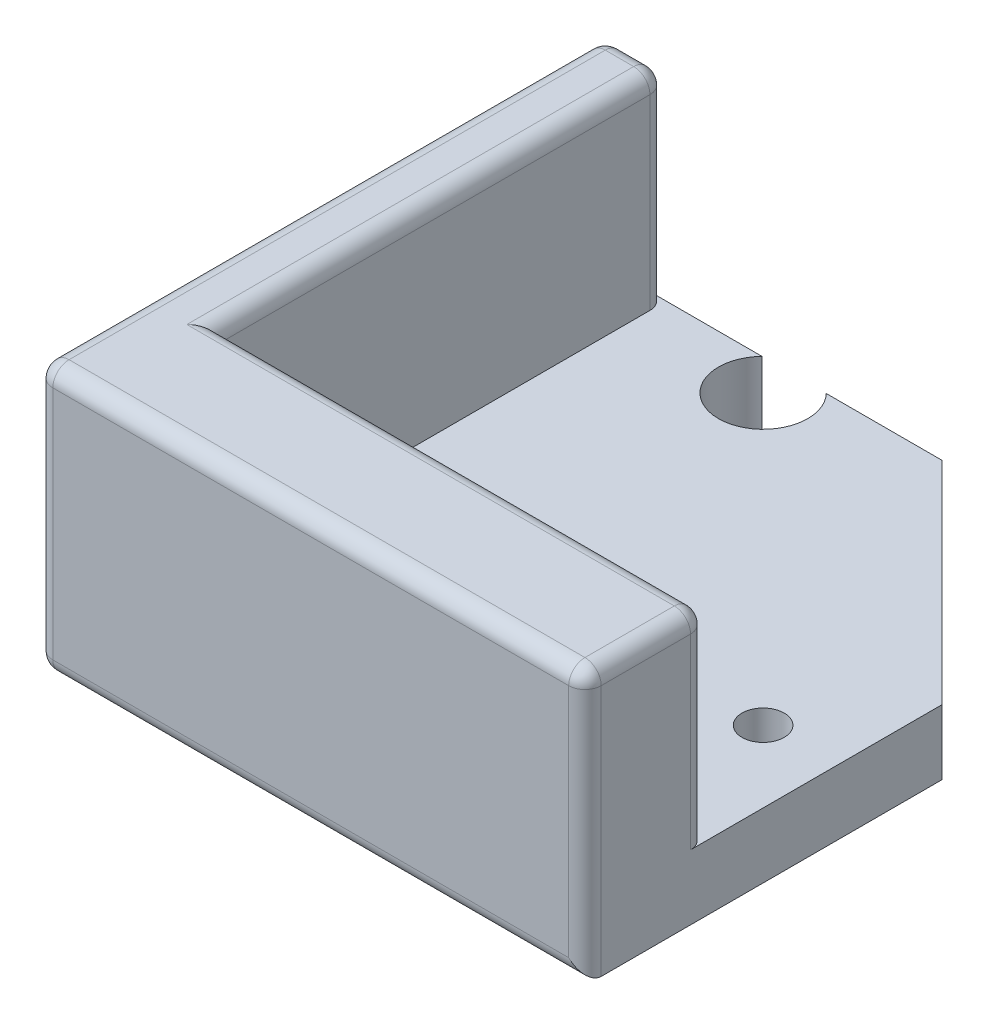
ISO-10303-21;
HEADER;
FILE_DESCRIPTION(('STEP AP214'),'2;1');
FILE_NAME('part.step','',(''),(''),'','','');
FILE_SCHEMA(('AUTOMOTIVE_DESIGN { 1 0 10303 214 1 1 1 1 }'));
ENDSEC;
DATA;
#1=APPLICATION_CONTEXT('core data for automotive mechanical design processes');
#2=APPLICATION_PROTOCOL_DEFINITION('international standard','automotive_design',2000,#1);
#3=PRODUCT_CONTEXT('',#1,'mechanical');
#4=PRODUCT('Part','Part','',(#3));
#5=PRODUCT_RELATED_PRODUCT_CATEGORY('part','',(#4));
#6=PRODUCT_DEFINITION_FORMATION('','',#4);
#7=PRODUCT_DEFINITION_CONTEXT('part definition',#1,'design');
#8=PRODUCT_DEFINITION('design','',#6,#7);
#9=PRODUCT_DEFINITION_SHAPE('','',#8);
#10=(LENGTH_UNIT() NAMED_UNIT(*) SI_UNIT(.MILLI.,.METRE.));
#11=(NAMED_UNIT(*) PLANE_ANGLE_UNIT() SI_UNIT($,.RADIAN.));
#12=(NAMED_UNIT(*) SI_UNIT($,.STERADIAN.) SOLID_ANGLE_UNIT());
#13=UNCERTAINTY_MEASURE_WITH_UNIT(LENGTH_MEASURE(1.E-05),#10,'distance_accuracy_value','');
#14=(GEOMETRIC_REPRESENTATION_CONTEXT(3) GLOBAL_UNCERTAINTY_ASSIGNED_CONTEXT((#13)) GLOBAL_UNIT_ASSIGNED_CONTEXT((#10,
#11,#12)) REPRESENTATION_CONTEXT('',''));
#15=CARTESIAN_POINT('',(0.,0.,0.));
#16=DIRECTION('',(0.,0.,1.));
#17=DIRECTION('',(1.,0.,0.));
#18=AXIS2_PLACEMENT_3D('',#15,#16,#17);
#19=CARTESIAN_POINT('',(0.,2.54,0.));
#20=DIRECTION('',(0.,1.,0.));
#21=DIRECTION('',(0.,0.,1.));
#22=AXIS2_PLACEMENT_3D('',#19,#20,#21);
#23=PLANE('',#22);
#24=DIRECTION('',(-1.,0.,0.));
#25=VECTOR('',#24,1.);
#26=CARTESIAN_POINT('',(0.,2.54,-33.655));
#27=LINE('',#26,#25);
#28=CARTESIAN_POINT('',(-1.27,2.54,-33.655));
#29=VERTEX_POINT('',#28);
#30=CARTESIAN_POINT('',(-3.4925,2.54,-33.655));
#31=VERTEX_POINT('',#30);
#32=EDGE_CURVE('E72',#29,#31,#27,.T.);
#33=ORIENTED_EDGE('',*,*,#32,.T.);
#34=DIRECTION('',(0.,0.,1.));
#35=VECTOR('',#34,1.);
#36=CARTESIAN_POINT('',(-3.4925,2.54,0.));
#37=LINE('',#36,#35);
#38=CARTESIAN_POINT('',(-3.4925,2.54,8.255));
#39=VERTEX_POINT('',#38);
#40=EDGE_CURVE('E255',#31,#39,#37,.T.);
#41=ORIENTED_EDGE('',*,*,#40,.T.);
#42=DIRECTION('',(-1.,0.,0.));
#43=VECTOR('',#42,1.);
#44=CARTESIAN_POINT('',(38.1,2.54,8.255));
#45=LINE('',#44,#43);
#46=CARTESIAN_POINT('',(36.83,2.54,8.255));
#47=VERTEX_POINT('',#46);
#48=EDGE_CURVE('E350',#39,#47,#45,.F.);
#49=ORIENTED_EDGE('',*,*,#48,.T.);
#50=DIRECTION('',(0.,0.,-1.));
#51=VECTOR('',#50,1.);
#52=CARTESIAN_POINT('',(36.83,2.54,0.));
#53=LINE('',#52,#51);
#54=CARTESIAN_POINT('',(36.83,2.54,1.27));
#55=VERTEX_POINT('',#54);
#56=EDGE_CURVE('E358',#47,#55,#53,.T.);
#57=ORIENTED_EDGE('',*,*,#56,.T.);
#58=DIRECTION('',(1.,0.,0.));
#59=VECTOR('',#58,1.);
#60=CARTESIAN_POINT('',(0.,2.54,1.27));
#61=LINE('',#60,#59);
#62=CARTESIAN_POINT('',(-1.27,2.54,1.27));
#63=VERTEX_POINT('',#62);
#64=EDGE_CURVE('E362',#55,#63,#61,.F.);
#65=ORIENTED_EDGE('',*,*,#64,.T.);
#66=DIRECTION('',(0.,0.,1.));
#67=VECTOR('',#66,1.);
#68=CARTESIAN_POINT('',(-1.27,2.54,-38.1));
#69=LINE('',#68,#67);
#70=EDGE_CURVE('E365',#63,#29,#69,.F.);
#71=ORIENTED_EDGE('',*,*,#70,.T.);
#72=EDGE_LOOP('',(#33,#41,#49,#57,#65,#71));
#73=FACE_BOUND('',#72,.T.);
#74=ADVANCED_FACE('F46',(#73),#23,.T.);
#75=CARTESIAN_POINT('',(0.,-13.335,0.));
#76=DIRECTION('',(-1.,0.,0.));
#77=DIRECTION('',(0.,0.,1.));
#78=AXIS2_PLACEMENT_3D('',#75,#76,#77);
#79=PLANE('',#78);
#80=DIRECTION('',(0.,0.,1.));
#81=VECTOR('',#80,1.);
#82=CARTESIAN_POINT('',(0.,-13.335,0.));
#83=LINE('',#82,#81);
#84=CARTESIAN_POINT('',(0.,-13.335,-33.655));
#85=VERTEX_POINT('',#84);
#86=CARTESIAN_POINT('',(0.,-13.335,0.));
#87=VERTEX_POINT('',#86);
#88=EDGE_CURVE('E337',#85,#87,#83,.T.);
#89=ORIENTED_EDGE('',*,*,#88,.F.);
#90=DIRECTION('',(0.,-1.,0.));
#91=VECTOR('',#90,1.);
#92=CARTESIAN_POINT('',(0.,1.27,-33.655));
#93=LINE('',#92,#91);
#94=CARTESIAN_POINT('',(0.,1.27,-33.655));
#95=VERTEX_POINT('',#94);
#96=EDGE_CURVE('E229',#85,#95,#93,.F.);
#97=ORIENTED_EDGE('',*,*,#96,.T.);
#98=DIRECTION('',(0.,0.,1.));
#99=VECTOR('',#98,1.);
#100=CARTESIAN_POINT('',(0.,1.27,0.));
#101=LINE('',#100,#99);
#102=CARTESIAN_POINT('',(0.,1.27,0.));
#103=VERTEX_POINT('',#102);
#104=EDGE_CURVE('E378',#95,#103,#101,.T.);
#105=ORIENTED_EDGE('',*,*,#104,.T.);
#106=DIRECTION('',(0.,1.,0.));
#107=VECTOR('',#106,1.);
#108=CARTESIAN_POINT('',(0.,-13.335,0.));
#109=LINE('',#108,#107);
#110=EDGE_CURVE('E344',#87,#103,#109,.T.);
#111=ORIENTED_EDGE('',*,*,#110,.F.);
#112=EDGE_LOOP('',(#89,#97,#105,#111));
#113=FACE_BOUND('',#112,.T.);
#114=ADVANCED_FACE('F341',(#113),#79,.F.);
#115=CARTESIAN_POINT('',(0.,-13.335,9.525));
#116=DIRECTION('',(0.,0.,-1.));
#117=DIRECTION('',(-1.,0.,0.));
#118=AXIS2_PLACEMENT_3D('',#115,#116,#117);
#119=PLANE('',#118);
#120=DIRECTION('',(-1.,0.,0.));
#121=VECTOR('',#120,1.);
#122=CARTESIAN_POINT('',(-9.52499999999999,1.27,9.525));
#123=LINE('',#122,#121);
#124=CARTESIAN_POINT('',(36.83,1.27,9.525));
#125=VERTEX_POINT('',#124);
#126=CARTESIAN_POINT('',(-3.49249999999999,1.27,9.525));
#127=VERTEX_POINT('',#126);
#128=EDGE_CURVE('E387',#125,#127,#123,.T.);
#129=ORIENTED_EDGE('',*,*,#128,.T.);
#130=DIRECTION('',(0.,1.,0.));
#131=VECTOR('',#130,1.);
#132=CARTESIAN_POINT('',(-3.49249999999999,-17.145,9.525));
#133=LINE('',#132,#131);
#134=CARTESIAN_POINT('',(-3.4925,-17.145,9.525));
#135=VERTEX_POINT('',#134);
#136=EDGE_CURVE('E56',#127,#135,#133,.F.);
#137=ORIENTED_EDGE('',*,*,#136,.T.);
#138=DIRECTION('',(-1.,0.,0.));
#139=VECTOR('',#138,1.);
#140=CARTESIAN_POINT('',(38.1,-17.145,9.525));
#141=LINE('',#140,#139);
#142=CARTESIAN_POINT('',(36.83,-17.145,9.525));
#143=VERTEX_POINT('',#142);
#144=EDGE_CURVE('E390',#135,#143,#141,.F.);
#145=ORIENTED_EDGE('',*,*,#144,.T.);
#146=DIRECTION('',(0.,1.,0.));
#147=VECTOR('',#146,1.);
#148=CARTESIAN_POINT('',(36.83,-13.335,9.525));
#149=LINE('',#148,#147);
#150=EDGE_CURVE('E393',#143,#125,#149,.T.);
#151=ORIENTED_EDGE('',*,*,#150,.T.);
#152=EDGE_LOOP('',(#129,#137,#145,#151));
#153=FACE_BOUND('',#152,.T.);
#154=ADVANCED_FACE('F508',(#153),#119,.F.);
#155=CARTESIAN_POINT('',(0.,-13.335,0.));
#156=DIRECTION('',(0.,-1.,0.));
#157=DIRECTION('',(0.,0.,-1.));
#158=AXIS2_PLACEMENT_3D('',#155,#156,#157);
#159=PLANE('',#158);
#160=CARTESIAN_POINT('',(32.5,-13.335,-10.));
#161=DIRECTION('',(0.,-1.,0.));
#162=DIRECTION('',(0.,0.,-1.));
#163=AXIS2_PLACEMENT_3D('',#160,#161,#162);
#164=CIRCLE('',#163,1.65);
#165=CARTESIAN_POINT('',(32.5,-13.335,-11.65));
#166=VERTEX_POINT('',#165);
#167=EDGE_CURVE('E435',#166,#166,#164,.T.);
#168=ORIENTED_EDGE('',*,*,#167,.T.);
#169=EDGE_LOOP('',(#168));
#170=FACE_BOUND('',#169,.T.);
#171=DIRECTION('',(1.,0.,0.));
#172=VECTOR('',#171,1.);
#173=CARTESIAN_POINT('',(0.,-13.335,-34.925));
#174=LINE('',#173,#172);
#175=CARTESIAN_POINT('',(-1.27,-13.335,-34.925));
#176=VERTEX_POINT('',#175);
#177=CARTESIAN_POINT('',(7.48664939771626,-13.335,-34.925));
#178=VERTEX_POINT('',#177);
#179=EDGE_CURVE('E185',#176,#178,#174,.T.);
#180=ORIENTED_EDGE('',*,*,#179,.F.);
#181=CARTESIAN_POINT('',(-1.27,-13.335,-33.655));
#182=DIRECTION('',(0.,-1.,0.));
#183=DIRECTION('',(0.,0.,-1.));
#184=AXIS2_PLACEMENT_3D('',#181,#182,#183);
#185=CIRCLE('',#184,1.27);
#186=EDGE_CURVE('E11',#176,#85,#185,.T.);
#187=ORIENTED_EDGE('',*,*,#186,.T.);
#188=ORIENTED_EDGE('',*,*,#88,.T.);
#189=DIRECTION('',(-1.,0.,0.));
#190=VECTOR('',#189,1.);
#191=CARTESIAN_POINT('',(0.,-13.335,0.));
#192=LINE('',#191,#190);
#193=CARTESIAN_POINT('',(36.83,-13.335,0.));
#194=VERTEX_POINT('',#193);
#195=EDGE_CURVE('E346',#194,#87,#192,.T.);
#196=ORIENTED_EDGE('',*,*,#195,.F.);
#197=CARTESIAN_POINT('',(36.83,-13.335,1.27));
#198=DIRECTION('',(0.,-1.,0.));
#199=DIRECTION('',(0.,0.,-1.));
#200=AXIS2_PLACEMENT_3D('',#197,#198,#199);
#201=CIRCLE('',#200,1.27);
#202=CARTESIAN_POINT('',(38.1,-13.335,1.27));
#203=VERTEX_POINT('',#202);
#204=EDGE_CURVE('E223',#194,#203,#201,.T.);
#205=ORIENTED_EDGE('',*,*,#204,.T.);
#206=DIRECTION('',(0.,0.,1.));
#207=VECTOR('',#206,1.);
#208=CARTESIAN_POINT('',(38.1,-13.335,9.52500000000001));
#209=LINE('',#208,#207);
#210=CARTESIAN_POINT('',(38.1,-13.335,-18.3730790919814));
#211=VERTEX_POINT('',#210);
#212=EDGE_CURVE('E449',#211,#203,#209,.T.);
#213=ORIENTED_EDGE('',*,*,#212,.F.);
#214=DIRECTION('',(0.707106781186549,0.,0.707106781186546));
#215=VECTOR('',#214,1.);
#216=CARTESIAN_POINT('',(38.1,-13.335,-18.3730790919814));
#217=LINE('',#216,#215);
#218=CARTESIAN_POINT('',(21.5480790919814,-13.335,-34.925));
#219=VERTEX_POINT('',#218);
#220=EDGE_CURVE('E441',#219,#211,#217,.T.);
#221=ORIENTED_EDGE('',*,*,#220,.F.);
#222=DIRECTION('',(1.,0.,0.));
#223=VECTOR('',#222,1.);
#224=CARTESIAN_POINT('',(0.,-13.335,-34.925));
#225=LINE('',#224,#223);
#226=CARTESIAN_POINT('',(12.5133506022837,-13.335,-34.925));
#227=VERTEX_POINT('',#226);
#228=EDGE_CURVE('E860',#227,#219,#225,.T.);
#229=ORIENTED_EDGE('',*,*,#228,.F.);
#230=CARTESIAN_POINT('',(10.,-13.335,-32.5));
#231=DIRECTION('',(0.,1.,0.));
#232=DIRECTION('',(0.,0.,1.));
#233=AXIS2_PLACEMENT_3D('',#230,#231,#232);
#234=CIRCLE('',#233,3.4925);
#235=EDGE_CURVE('E208',#178,#227,#234,.T.);
#236=ORIENTED_EDGE('',*,*,#235,.F.);
#237=EDGE_LOOP('',(#180,#187,#188,#196,#205,#213,#221,#229,#236));
#238=FACE_BOUND('',#237,.T.);
#239=ADVANCED_FACE('F335',(#170,#238),#159,.F.);
#240=CARTESIAN_POINT('',(38.1,-18.415,-18.3730790919814));
#241=DIRECTION('',(-0.707106781186546,0.,0.707106781186549));
#242=DIRECTION('',(0.707106781186549,0.,0.707106781186546));
#243=AXIS2_PLACEMENT_3D('',#240,#241,#242);
#244=PLANE('',#243);
#245=DIRECTION('',(0.,-1.,0.));
#246=VECTOR('',#245,1.);
#247=CARTESIAN_POINT('',(21.5480790919814,-18.415,-34.925));
#248=LINE('',#247,#246);
#249=CARTESIAN_POINT('',(21.5480790919814,-18.415,-34.925));
#250=VERTEX_POINT('',#249);
#251=EDGE_CURVE('E858',#219,#250,#248,.T.);
#252=ORIENTED_EDGE('',*,*,#251,.F.);
#253=ORIENTED_EDGE('',*,*,#220,.T.);
#254=DIRECTION('',(0.,1.,0.));
#255=VECTOR('',#254,1.);
#256=CARTESIAN_POINT('',(38.1,-18.415,-18.3730790919814));
#257=LINE('',#256,#255);
#258=CARTESIAN_POINT('',(38.1,-18.415,-18.3730790919814));
#259=VERTEX_POINT('',#258);
#260=EDGE_CURVE('E352',#259,#211,#257,.T.);
#261=ORIENTED_EDGE('',*,*,#260,.F.);
#262=DIRECTION('',(0.707106781186549,0.,0.707106781186546));
#263=VECTOR('',#262,1.);
#264=CARTESIAN_POINT('',(38.1,-18.415,-18.3730790919814));
#265=LINE('',#264,#263);
#266=EDGE_CURVE('E445',#250,#259,#265,.T.);
#267=ORIENTED_EDGE('',*,*,#266,.F.);
#268=EDGE_LOOP('',(#252,#253,#261,#267));
#269=FACE_BOUND('',#268,.T.);
#270=ADVANCED_FACE('F577',(#269),#244,.F.);
#271=CARTESIAN_POINT('',(0.,-18.415,0.));
#272=DIRECTION('',(0.,-1.,0.));
#273=DIRECTION('',(0.,0.,-1.));
#274=AXIS2_PLACEMENT_3D('',#271,#272,#273);
#275=PLANE('',#274);
#276=CARTESIAN_POINT('',(32.5,-18.415,-10.));
#277=DIRECTION('',(0.,-1.,0.));
#278=DIRECTION('',(0.,0.,-1.));
#279=AXIS2_PLACEMENT_3D('',#276,#277,#278);
#280=CIRCLE('',#279,1.65);
#281=CARTESIAN_POINT('',(32.5,-18.415,-11.65));
#282=VERTEX_POINT('',#281);
#283=EDGE_CURVE('E428',#282,#282,#280,.T.);
#284=ORIENTED_EDGE('',*,*,#283,.F.);
#285=EDGE_LOOP('',(#284));
#286=FACE_BOUND('',#285,.T.);
#287=DIRECTION('',(-1.,0.,0.));
#288=VECTOR('',#287,1.);
#289=CARTESIAN_POINT('',(-9.52499999999999,-18.415,8.255));
#290=LINE('',#289,#288);
#291=CARTESIAN_POINT('',(38.1,-18.415,8.255));
#292=VERTEX_POINT('',#291);
#293=CARTESIAN_POINT('',(-3.49249999999999,-18.415,8.255));
#294=VERTEX_POINT('',#293);
#295=EDGE_CURVE('E397',#292,#294,#290,.T.);
#296=ORIENTED_EDGE('',*,*,#295,.T.);
#297=DIRECTION('',(0.,0.,1.));
#298=VECTOR('',#297,1.);
#299=CARTESIAN_POINT('',(-3.4925,-18.415,0.));
#300=LINE('',#299,#298);
#301=CARTESIAN_POINT('',(-3.4925,-18.415,-34.925));
#302=VERTEX_POINT('',#301);
#303=EDGE_CURVE('E201',#294,#302,#300,.F.);
#304=ORIENTED_EDGE('',*,*,#303,.T.);
#305=DIRECTION('',(-1.,0.,0.));
#306=VECTOR('',#305,1.);
#307=CARTESIAN_POINT('',(0.,-18.415,-34.925));
#308=LINE('',#307,#306);
#309=CARTESIAN_POINT('',(7.48664939771626,-18.415,-34.925));
#310=VERTEX_POINT('',#309);
#311=EDGE_CURVE('E183',#310,#302,#308,.T.);
#312=ORIENTED_EDGE('',*,*,#311,.F.);
#313=CARTESIAN_POINT('',(10.,-18.415,-32.5));
#314=DIRECTION('',(0.,-1.,0.));
#315=DIRECTION('',(0.,0.,-1.));
#316=AXIS2_PLACEMENT_3D('',#313,#314,#315);
#317=CIRCLE('',#316,3.4925);
#318=CARTESIAN_POINT('',(12.5133506022837,-18.415,-34.925));
#319=VERTEX_POINT('',#318);
#320=EDGE_CURVE('E199',#319,#310,#317,.T.);
#321=ORIENTED_EDGE('',*,*,#320,.F.);
#322=DIRECTION('',(-1.,0.,0.));
#323=VECTOR('',#322,1.);
#324=CARTESIAN_POINT('',(0.,-18.415,-34.925));
#325=LINE('',#324,#323);
#326=EDGE_CURVE('E192',#250,#319,#325,.T.);
#327=ORIENTED_EDGE('',*,*,#326,.F.);
#328=ORIENTED_EDGE('',*,*,#266,.T.);
#329=DIRECTION('',(0.,0.,1.));
#330=VECTOR('',#329,1.);
#331=CARTESIAN_POINT('',(38.1,-18.415,9.52500000000001));
#332=LINE('',#331,#330);
#333=EDGE_CURVE('E448',#259,#292,#332,.T.);
#334=ORIENTED_EDGE('',*,*,#333,.T.);
#335=EDGE_LOOP('',(#296,#304,#312,#321,#327,#328,#334));
#336=FACE_BOUND('',#335,.T.);
#337=ADVANCED_FACE('F197',(#286,#336),#275,.T.);
#338=CARTESIAN_POINT('',(0.,-17.145,8.255));
#339=DIRECTION('',(1.,0.,0.));
#340=DIRECTION('',(0.,0.,-1.));
#341=AXIS2_PLACEMENT_3D('',#338,#339,#340);
#342=CYLINDRICAL_SURFACE('',#341,1.27);
#343=ORIENTED_EDGE('',*,*,#144,.F.);
#344=CARTESIAN_POINT('',(-3.49249999999999,-17.145,8.255));
#345=DIRECTION('',(1.,0.,0.));
#346=DIRECTION('',(0.,0.,-1.));
#347=AXIS2_PLACEMENT_3D('',#344,#345,#346);
#348=CIRCLE('',#347,1.27);
#349=EDGE_CURVE('E235',#135,#294,#348,.T.);
#350=ORIENTED_EDGE('',*,*,#349,.T.);
#351=ORIENTED_EDGE('',*,*,#295,.F.);
#352=CARTESIAN_POINT('',(36.83,-17.145,8.255));
#353=DIRECTION('',(0.707106781186547,0.707106781186547,0.));
#354=DIRECTION('',(0.707106781186547,-0.707106781186547,0.));
#355=AXIS2_PLACEMENT_3D('',#352,#353,#354);
#356=ELLIPSE('',#355,1.79605122421383,1.27);
#357=EDGE_CURVE('E217',#143,#292,#356,.T.);
#358=ORIENTED_EDGE('',*,*,#357,.F.);
#359=EDGE_LOOP('',(#343,#350,#351,#358));
#360=FACE_BOUND('',#359,.T.);
#361=ADVANCED_FACE('F531',(#360),#342,.T.);
#362=CARTESIAN_POINT('',(-1.27,1.27,0.));
#363=DIRECTION('',(0.,0.,-1.));
#364=DIRECTION('',(-1.,0.,0.));
#365=AXIS2_PLACEMENT_3D('',#362,#363,#364);
#366=CYLINDRICAL_SURFACE('',#365,1.27);
#367=ORIENTED_EDGE('',*,*,#104,.F.);
#368=CARTESIAN_POINT('',(-1.27,1.27,-33.655));
#369=DIRECTION('',(0.,0.,-1.));
#370=DIRECTION('',(-1.,0.,0.));
#371=AXIS2_PLACEMENT_3D('',#368,#369,#370);
#372=CIRCLE('',#371,1.27);
#373=EDGE_CURVE('E232',#95,#29,#372,.F.);
#374=ORIENTED_EDGE('',*,*,#373,.T.);
#375=ORIENTED_EDGE('',*,*,#70,.F.);
#376=CARTESIAN_POINT('',(-1.27,1.27,1.27));
#377=DIRECTION('',(-0.707106781186547,0.,-0.707106781186547));
#378=DIRECTION('',(0.707106781186547,0.,-0.707106781186547));
#379=AXIS2_PLACEMENT_3D('',#376,#377,#378);
#380=ELLIPSE('',#379,1.79605122421383,1.27);
#381=EDGE_CURVE('E419',#103,#63,#380,.F.);
#382=ORIENTED_EDGE('',*,*,#381,.F.);
#383=EDGE_LOOP('',(#367,#374,#375,#382));
#384=FACE_BOUND('',#383,.T.);
#385=ADVANCED_FACE('F524',(#384),#366,.T.);
#386=CARTESIAN_POINT('',(0.,1.27,8.255));
#387=DIRECTION('',(1.,0.,0.));
#388=DIRECTION('',(0.,0.,-1.));
#389=AXIS2_PLACEMENT_3D('',#386,#387,#388);
#390=CYLINDRICAL_SURFACE('',#389,1.27);
#391=ORIENTED_EDGE('',*,*,#48,.F.);
#392=CARTESIAN_POINT('',(-3.49249999999999,1.27,8.255));
#393=DIRECTION('',(1.,0.,0.));
#394=DIRECTION('',(0.,0.,-1.));
#395=AXIS2_PLACEMENT_3D('',#392,#393,#394);
#396=CIRCLE('',#395,1.27);
#397=EDGE_CURVE('E64',#39,#127,#396,.T.);
#398=ORIENTED_EDGE('',*,*,#397,.T.);
#399=ORIENTED_EDGE('',*,*,#128,.F.);
#400=CARTESIAN_POINT('',(36.83,1.27,8.255));
#401=DIRECTION('',(1.,0.,0.));
#402=DIRECTION('',(0.,0.,-1.));
#403=AXIS2_PLACEMENT_3D('',#400,#401,#402);
#404=CIRCLE('',#403,1.27);
#405=EDGE_CURVE('E413',#47,#125,#404,.T.);
#406=ORIENTED_EDGE('',*,*,#405,.F.);
#407=EDGE_LOOP('',(#391,#398,#399,#406));
#408=FACE_BOUND('',#407,.T.);
#409=ADVANCED_FACE('F485',(#408),#390,.T.);
#410=CARTESIAN_POINT('',(10.,-23.495,-32.5));
#411=DIRECTION('',(0.,1.,0.));
#412=DIRECTION('',(0.,0.,1.));
#413=AXIS2_PLACEMENT_3D('',#410,#411,#412);
#414=CYLINDRICAL_SURFACE('',#413,3.4925);
#415=DIRECTION('',(0.,1.,0.));
#416=VECTOR('',#415,1.);
#417=CARTESIAN_POINT('',(7.48664939771626,-18.415,-34.925));
#418=LINE('',#417,#416);
#419=EDGE_CURVE('E179',#310,#178,#418,.T.);
#420=ORIENTED_EDGE('',*,*,#419,.T.);
#421=ORIENTED_EDGE('',*,*,#235,.T.);
#422=DIRECTION('',(0.,1.,0.));
#423=VECTOR('',#422,1.);
#424=CARTESIAN_POINT('',(12.5133506022837,-18.415,-34.925));
#425=LINE('',#424,#423);
#426=EDGE_CURVE('E191',#319,#227,#425,.T.);
#427=ORIENTED_EDGE('',*,*,#426,.F.);
#428=ORIENTED_EDGE('',*,*,#320,.T.);
#429=EDGE_LOOP('',(#420,#421,#427,#428));
#430=FACE_BOUND('',#429,.T.);
#431=ADVANCED_FACE('F205',(#430),#414,.F.);
#432=CARTESIAN_POINT('',(38.1,2.54,0.));
#433=DIRECTION('',(-1.,0.,0.));
#434=DIRECTION('',(0.,0.,1.));
#435=AXIS2_PLACEMENT_3D('',#432,#433,#434);
#436=PLANE('',#435);
#437=DIRECTION('',(0.,0.,-1.));
#438=VECTOR('',#437,1.);
#439=CARTESIAN_POINT('',(38.1,1.27,9.525));
#440=LINE('',#439,#438);
#441=CARTESIAN_POINT('',(38.1,1.27,1.27));
#442=VERTEX_POINT('',#441);
#443=CARTESIAN_POINT('',(38.1,1.27,8.255));
#444=VERTEX_POINT('',#443);
#445=EDGE_CURVE('E371',#442,#444,#440,.F.);
#446=ORIENTED_EDGE('',*,*,#445,.T.);
#447=DIRECTION('',(0.,1.,0.));
#448=VECTOR('',#447,1.);
#449=CARTESIAN_POINT('',(38.1,2.54,8.255));
#450=LINE('',#449,#448);
#451=EDGE_CURVE('E375',#444,#292,#450,.F.);
#452=ORIENTED_EDGE('',*,*,#451,.T.);
#453=ORIENTED_EDGE('',*,*,#333,.F.);
#454=ORIENTED_EDGE('',*,*,#260,.T.);
#455=ORIENTED_EDGE('',*,*,#212,.T.);
#456=DIRECTION('',(0.,1.,0.));
#457=VECTOR('',#456,1.);
#458=CARTESIAN_POINT('',(38.1,2.54,1.27));
#459=LINE('',#458,#457);
#460=EDGE_CURVE('E368',#203,#442,#459,.T.);
#461=ORIENTED_EDGE('',*,*,#460,.T.);
#462=EDGE_LOOP('',(#446,#452,#453,#454,#455,#461));
#463=FACE_BOUND('',#462,.T.);
#464=ADVANCED_FACE('F462',(#463),#436,.F.);
#465=CARTESIAN_POINT('',(0.,-13.335,0.));
#466=DIRECTION('',(0.,0.,-1.));
#467=DIRECTION('',(-1.,0.,0.));
#468=AXIS2_PLACEMENT_3D('',#465,#466,#467);
#469=PLANE('',#468);
#470=ORIENTED_EDGE('',*,*,#110,.T.);
#471=DIRECTION('',(1.,0.,0.));
#472=VECTOR('',#471,1.);
#473=CARTESIAN_POINT('',(0.,1.27,0.));
#474=LINE('',#473,#472);
#475=CARTESIAN_POINT('',(36.83,1.27,0.));
#476=VERTEX_POINT('',#475);
#477=EDGE_CURVE('E384',#103,#476,#474,.T.);
#478=ORIENTED_EDGE('',*,*,#477,.T.);
#479=DIRECTION('',(0.,1.,0.));
#480=VECTOR('',#479,1.);
#481=CARTESIAN_POINT('',(36.83,-13.335,0.));
#482=LINE('',#481,#480);
#483=EDGE_CURVE('E381',#476,#194,#482,.F.);
#484=ORIENTED_EDGE('',*,*,#483,.T.);
#485=ORIENTED_EDGE('',*,*,#195,.T.);
#486=EDGE_LOOP('',(#470,#478,#484,#485));
#487=FACE_BOUND('',#486,.T.);
#488=ADVANCED_FACE('F498',(#487),#469,.T.);
#489=CARTESIAN_POINT('',(32.5,-18.415,-10.));
#490=DIRECTION('',(0.,-1.,0.));
#491=DIRECTION('',(0.,0.,-1.));
#492=AXIS2_PLACEMENT_3D('',#489,#490,#491);
#493=CYLINDRICAL_SURFACE('',#492,1.65);
#494=ORIENTED_EDGE('',*,*,#283,.T.);
#495=EDGE_LOOP('',(#494));
#496=FACE_BOUND('',#495,.T.);
#497=ORIENTED_EDGE('',*,*,#167,.F.);
#498=EDGE_LOOP('',(#497));
#499=FACE_BOUND('',#498,.T.);
#500=ADVANCED_FACE('F491',(#496,#499),#493,.F.);
#501=CARTESIAN_POINT('',(36.83,-13.335,8.255));
#502=DIRECTION('',(0.,1.,0.));
#503=DIRECTION('',(0.,0.,1.));
#504=AXIS2_PLACEMENT_3D('',#501,#502,#503);
#505=CYLINDRICAL_SURFACE('',#504,1.27);
#506=ORIENTED_EDGE('',*,*,#357,.T.);
#507=ORIENTED_EDGE('',*,*,#451,.F.);
#508=CARTESIAN_POINT('',(36.83,1.27,8.255));
#509=DIRECTION('',(0.,1.,0.));
#510=DIRECTION('',(-1.,0.,0.));
#511=AXIS2_PLACEMENT_3D('',#508,#509,#510);
#512=CIRCLE('',#511,1.27);
#513=EDGE_CURVE('E416',#125,#444,#512,.T.);
#514=ORIENTED_EDGE('',*,*,#513,.F.);
#515=ORIENTED_EDGE('',*,*,#150,.F.);
#516=EDGE_LOOP('',(#506,#507,#514,#515));
#517=FACE_BOUND('',#516,.T.);
#518=ADVANCED_FACE('F489',(#517),#505,.T.);
#519=CARTESIAN_POINT('',(0.,1.27,1.27));
#520=DIRECTION('',(1.,0.,0.));
#521=DIRECTION('',(0.,0.,-1.));
#522=AXIS2_PLACEMENT_3D('',#519,#520,#521);
#523=CYLINDRICAL_SURFACE('',#522,1.27);
#524=ORIENTED_EDGE('',*,*,#381,.T.);
#525=ORIENTED_EDGE('',*,*,#64,.F.);
#526=CARTESIAN_POINT('',(36.83,1.27,1.27));
#527=DIRECTION('',(1.,0.,0.));
#528=DIRECTION('',(0.,0.,-1.));
#529=AXIS2_PLACEMENT_3D('',#526,#527,#528);
#530=CIRCLE('',#529,1.27);
#531=EDGE_CURVE('E409',#476,#55,#530,.T.);
#532=ORIENTED_EDGE('',*,*,#531,.F.);
#533=ORIENTED_EDGE('',*,*,#477,.F.);
#534=EDGE_LOOP('',(#524,#525,#532,#533));
#535=FACE_BOUND('',#534,.T.);
#536=ADVANCED_FACE('F482',(#535),#523,.T.);
#537=CARTESIAN_POINT('',(36.83,2.54,1.27));
#538=DIRECTION('',(0.,-1.,0.));
#539=DIRECTION('',(0.,0.,-1.));
#540=AXIS2_PLACEMENT_3D('',#537,#538,#539);
#541=CYLINDRICAL_SURFACE('',#540,1.27);
#542=ORIENTED_EDGE('',*,*,#204,.F.);
#543=ORIENTED_EDGE('',*,*,#483,.F.);
#544=CARTESIAN_POINT('',(36.83,1.27,1.27));
#545=DIRECTION('',(0.,1.,0.));
#546=DIRECTION('',(0.,0.,1.));
#547=AXIS2_PLACEMENT_3D('',#544,#545,#546);
#548=CIRCLE('',#547,1.27);
#549=EDGE_CURVE('E405',#442,#476,#548,.T.);
#550=ORIENTED_EDGE('',*,*,#549,.F.);
#551=ORIENTED_EDGE('',*,*,#460,.F.);
#552=EDGE_LOOP('',(#542,#543,#550,#551));
#553=FACE_BOUND('',#552,.T.);
#554=ADVANCED_FACE('F472',(#553),#541,.T.);
#555=CARTESIAN_POINT('',(36.83,1.27,8.255));
#556=DIRECTION('',(0.,0.,1.));
#557=DIRECTION('',(0.,-1.,0.));
#558=AXIS2_PLACEMENT_3D('',#555,#556,#557);
#559=SPHERICAL_SURFACE('',#558,1.27);
#560=ORIENTED_EDGE('',*,*,#405,.T.);
#561=ORIENTED_EDGE('',*,*,#513,.T.);
#562=CARTESIAN_POINT('',(36.83,1.27,8.255));
#563=DIRECTION('',(0.,0.,1.));
#564=DIRECTION('',(1.,0.,0.));
#565=AXIS2_PLACEMENT_3D('',#562,#563,#564);
#566=CIRCLE('',#565,1.27);
#567=EDGE_CURVE('E212',#47,#444,#566,.F.);
#568=ORIENTED_EDGE('',*,*,#567,.F.);
#569=EDGE_LOOP('',(#560,#561,#568));
#570=FACE_BOUND('',#569,.T.);
#571=ADVANCED_FACE('F488',(#570),#559,.T.);
#572=CARTESIAN_POINT('',(36.83,1.27,1.27));
#573=DIRECTION('',(0.,0.,-1.));
#574=DIRECTION('',(0.,1.,0.));
#575=AXIS2_PLACEMENT_3D('',#572,#573,#574);
#576=SPHERICAL_SURFACE('',#575,1.27);
#577=ORIENTED_EDGE('',*,*,#549,.T.);
#578=ORIENTED_EDGE('',*,*,#531,.T.);
#579=CARTESIAN_POINT('',(36.83,1.27,1.27));
#580=DIRECTION('',(0.,0.,-1.));
#581=DIRECTION('',(-1.,0.,0.));
#582=AXIS2_PLACEMENT_3D('',#579,#580,#581);
#583=CIRCLE('',#582,1.27);
#584=EDGE_CURVE('E207',#442,#55,#583,.F.);
#585=ORIENTED_EDGE('',*,*,#584,.F.);
#586=EDGE_LOOP('',(#577,#578,#585));
#587=FACE_BOUND('',#586,.T.);
#588=ADVANCED_FACE('F480',(#587),#576,.T.);
#589=CARTESIAN_POINT('',(36.83,1.27,0.));
#590=DIRECTION('',(0.,0.,1.));
#591=DIRECTION('',(1.,0.,0.));
#592=AXIS2_PLACEMENT_3D('',#589,#590,#591);
#593=CYLINDRICAL_SURFACE('',#592,1.27);
#594=ORIENTED_EDGE('',*,*,#567,.T.);
#595=ORIENTED_EDGE('',*,*,#445,.F.);
#596=ORIENTED_EDGE('',*,*,#584,.T.);
#597=ORIENTED_EDGE('',*,*,#56,.F.);
#598=EDGE_LOOP('',(#594,#595,#596,#597));
#599=FACE_BOUND('',#598,.T.);
#600=ADVANCED_FACE('F476',(#599),#593,.T.);
#601=CARTESIAN_POINT('',(0.,-18.415,-34.925));
#602=DIRECTION('',(0.,0.,-1.));
#603=DIRECTION('',(-1.,0.,0.));
#604=AXIS2_PLACEMENT_3D('',#601,#602,#603);
#605=PLANE('',#604);
#606=ORIENTED_EDGE('',*,*,#228,.T.);
#607=ORIENTED_EDGE('',*,*,#251,.T.);
#608=ORIENTED_EDGE('',*,*,#326,.T.);
#609=ORIENTED_EDGE('',*,*,#426,.T.);
#610=EDGE_LOOP('',(#606,#607,#608,#609));
#611=FACE_BOUND('',#610,.T.);
#612=ADVANCED_FACE('F517',(#611),#605,.T.);
#613=CARTESIAN_POINT('',(0.,-18.415,-34.925));
#614=DIRECTION('',(0.,0.,-1.));
#615=DIRECTION('',(-1.,0.,0.));
#616=AXIS2_PLACEMENT_3D('',#613,#614,#615);
#617=PLANE('',#616);
#618=DIRECTION('',(0.,-1.,0.));
#619=VECTOR('',#618,1.);
#620=CARTESIAN_POINT('',(-1.27,-13.335,-34.925));
#621=LINE('',#620,#619);
#622=CARTESIAN_POINT('',(-1.27,1.27,-34.925));
#623=VERTEX_POINT('',#622);
#624=EDGE_CURVE('E226',#623,#176,#621,.T.);
#625=ORIENTED_EDGE('',*,*,#624,.T.);
#626=ORIENTED_EDGE('',*,*,#179,.T.);
#627=ORIENTED_EDGE('',*,*,#419,.F.);
#628=ORIENTED_EDGE('',*,*,#311,.T.);
#629=DIRECTION('',(0.,1.,0.));
#630=VECTOR('',#629,1.);
#631=CARTESIAN_POINT('',(-3.4925,-18.415,-34.925));
#632=LINE('',#631,#630);
#633=CARTESIAN_POINT('',(-3.4925,1.27,-34.925));
#634=VERTEX_POINT('',#633);
#635=EDGE_CURVE('E222',#302,#634,#632,.T.);
#636=ORIENTED_EDGE('',*,*,#635,.T.);
#637=DIRECTION('',(-1.,0.,0.));
#638=VECTOR('',#637,1.);
#639=CARTESIAN_POINT('',(0.,1.27,-34.925));
#640=LINE('',#639,#638);
#641=EDGE_CURVE('E219',#634,#623,#640,.F.);
#642=ORIENTED_EDGE('',*,*,#641,.T.);
#643=EDGE_LOOP('',(#625,#626,#627,#628,#636,#642));
#644=FACE_BOUND('',#643,.T.);
#645=ADVANCED_FACE('F182',(#644),#617,.T.);
#646=CARTESIAN_POINT('',(-4.7625,-18.415,0.));
#647=DIRECTION('',(-1.,0.,0.));
#648=DIRECTION('',(0.,0.,1.));
#649=AXIS2_PLACEMENT_3D('',#646,#647,#648);
#650=PLANE('',#649);
#651=DIRECTION('',(0.,1.,0.));
#652=VECTOR('',#651,1.);
#653=CARTESIAN_POINT('',(-4.7625,-18.415,-33.655));
#654=LINE('',#653,#652);
#655=CARTESIAN_POINT('',(-4.7625,1.27,-33.655));
#656=VERTEX_POINT('',#655);
#657=CARTESIAN_POINT('',(-4.7625,-17.145,-33.655));
#658=VERTEX_POINT('',#657);
#659=EDGE_CURVE('E244',#656,#658,#654,.F.);
#660=ORIENTED_EDGE('',*,*,#659,.T.);
#661=DIRECTION('',(0.,0.,1.));
#662=VECTOR('',#661,1.);
#663=CARTESIAN_POINT('',(-4.7625,-17.145,0.));
#664=LINE('',#663,#662);
#665=CARTESIAN_POINT('',(-4.76249999999999,-17.145,8.255));
#666=VERTEX_POINT('',#665);
#667=EDGE_CURVE('E247',#658,#666,#664,.T.);
#668=ORIENTED_EDGE('',*,*,#667,.T.);
#669=DIRECTION('',(0.,1.,0.));
#670=VECTOR('',#669,1.);
#671=CARTESIAN_POINT('',(-4.76249999999999,1.27,8.255));
#672=LINE('',#671,#670);
#673=CARTESIAN_POINT('',(-4.76249999999999,1.27,8.255));
#674=VERTEX_POINT('',#673);
#675=EDGE_CURVE('E238',#666,#674,#672,.T.);
#676=ORIENTED_EDGE('',*,*,#675,.T.);
#677=DIRECTION('',(0.,0.,1.));
#678=VECTOR('',#677,1.);
#679=CARTESIAN_POINT('',(-4.7625,1.27,0.));
#680=LINE('',#679,#678);
#681=EDGE_CURVE('E241',#674,#656,#680,.F.);
#682=ORIENTED_EDGE('',*,*,#681,.T.);
#683=EDGE_LOOP('',(#660,#668,#676,#682));
#684=FACE_BOUND('',#683,.T.);
#685=ADVANCED_FACE('F310',(#684),#650,.T.);
#686=CARTESIAN_POINT('',(-3.49249999999999,-18.415,8.255));
#687=DIRECTION('',(0.,-1.,0.));
#688=DIRECTION('',(0.,0.,-1.));
#689=AXIS2_PLACEMENT_3D('',#686,#687,#688);
#690=CYLINDRICAL_SURFACE('',#689,1.27);
#691=CARTESIAN_POINT('',(-3.49249999999999,-17.145,8.255));
#692=DIRECTION('',(0.,-1.,0.));
#693=DIRECTION('',(0.,0.,-1.));
#694=AXIS2_PLACEMENT_3D('',#691,#692,#693);
#695=CIRCLE('',#694,1.27);
#696=EDGE_CURVE('E50',#135,#666,#695,.T.);
#697=ORIENTED_EDGE('',*,*,#696,.F.);
#698=ORIENTED_EDGE('',*,*,#136,.F.);
#699=CARTESIAN_POINT('',(-3.49249999999999,1.27,8.255));
#700=DIRECTION('',(0.,1.,0.));
#701=DIRECTION('',(0.,0.,1.));
#702=AXIS2_PLACEMENT_3D('',#699,#700,#701);
#703=CIRCLE('',#702,1.27);
#704=EDGE_CURVE('E292',#674,#127,#703,.T.);
#705=ORIENTED_EDGE('',*,*,#704,.F.);
#706=ORIENTED_EDGE('',*,*,#675,.F.);
#707=EDGE_LOOP('',(#697,#698,#705,#706));
#708=FACE_BOUND('',#707,.T.);
#709=ADVANCED_FACE('F48',(#708),#690,.T.);
#710=CARTESIAN_POINT('',(-3.49249999999999,-17.145,8.255));
#711=DIRECTION('',(-1.,0.,0.));
#712=DIRECTION('',(0.,0.,1.));
#713=AXIS2_PLACEMENT_3D('',#710,#711,#712);
#714=SPHERICAL_SURFACE('',#713,1.27);
#715=ORIENTED_EDGE('',*,*,#349,.F.);
#716=ORIENTED_EDGE('',*,*,#696,.T.);
#717=CARTESIAN_POINT('',(-3.49249999999999,-17.145,8.255));
#718=DIRECTION('',(0.,0.,-1.));
#719=DIRECTION('',(0.,1.,0.));
#720=AXIS2_PLACEMENT_3D('',#717,#718,#719);
#721=CIRCLE('',#720,1.27);
#722=EDGE_CURVE('E290',#294,#666,#721,.T.);
#723=ORIENTED_EDGE('',*,*,#722,.F.);
#724=EDGE_LOOP('',(#715,#716,#723));
#725=FACE_BOUND('',#724,.T.);
#726=ADVANCED_FACE('F305',(#725),#714,.T.);
#727=CARTESIAN_POINT('',(-3.49249999999999,1.27,8.255));
#728=DIRECTION('',(-1.,0.,0.));
#729=DIRECTION('',(0.,0.,1.));
#730=AXIS2_PLACEMENT_3D('',#727,#728,#729);
#731=SPHERICAL_SURFACE('',#730,1.27);
#732=ORIENTED_EDGE('',*,*,#704,.T.);
#733=ORIENTED_EDGE('',*,*,#397,.F.);
#734=CARTESIAN_POINT('',(-3.49249999999999,1.27,8.255));
#735=DIRECTION('',(0.,0.,-1.));
#736=DIRECTION('',(0.,1.,0.));
#737=AXIS2_PLACEMENT_3D('',#734,#735,#736);
#738=CIRCLE('',#737,1.27);
#739=EDGE_CURVE('E286',#674,#39,#738,.T.);
#740=ORIENTED_EDGE('',*,*,#739,.F.);
#741=EDGE_LOOP('',(#732,#733,#740));
#742=FACE_BOUND('',#741,.T.);
#743=ADVANCED_FACE('F557',(#742),#731,.T.);
#744=CARTESIAN_POINT('',(-3.4925,-17.145,0.));
#745=DIRECTION('',(0.,0.,1.));
#746=DIRECTION('',(1.,0.,0.));
#747=AXIS2_PLACEMENT_3D('',#744,#745,#746);
#748=CYLINDRICAL_SURFACE('',#747,1.27);
#749=ORIENTED_EDGE('',*,*,#722,.T.);
#750=ORIENTED_EDGE('',*,*,#667,.F.);
#751=CARTESIAN_POINT('',(-3.4925,-17.145,-33.655));
#752=DIRECTION('',(0.,0.707106781186547,-0.707106781186547));
#753=DIRECTION('',(0.,0.707106781186547,0.707106781186547));
#754=AXIS2_PLACEMENT_3D('',#751,#752,#753);
#755=ELLIPSE('',#754,1.79605122421383,1.27);
#756=EDGE_CURVE('E282',#302,#658,#755,.T.);
#757=ORIENTED_EDGE('',*,*,#756,.F.);
#758=ORIENTED_EDGE('',*,*,#303,.F.);
#759=EDGE_LOOP('',(#749,#750,#757,#758));
#760=FACE_BOUND('',#759,.T.);
#761=ADVANCED_FACE('F313',(#760),#748,.T.);
#762=CARTESIAN_POINT('',(-3.4925,1.27,0.));
#763=DIRECTION('',(0.,0.,1.));
#764=DIRECTION('',(1.,0.,0.));
#765=AXIS2_PLACEMENT_3D('',#762,#763,#764);
#766=CYLINDRICAL_SURFACE('',#765,1.27);
#767=ORIENTED_EDGE('',*,*,#739,.T.);
#768=ORIENTED_EDGE('',*,*,#40,.F.);
#769=CARTESIAN_POINT('',(-3.4925,1.27,-33.655));
#770=DIRECTION('',(0.,0.,-1.));
#771=DIRECTION('',(-1.,0.,0.));
#772=AXIS2_PLACEMENT_3D('',#769,#770,#771);
#773=CIRCLE('',#772,1.27);
#774=EDGE_CURVE('E278',#656,#31,#773,.T.);
#775=ORIENTED_EDGE('',*,*,#774,.F.);
#776=ORIENTED_EDGE('',*,*,#681,.F.);
#777=EDGE_LOOP('',(#767,#768,#775,#776));
#778=FACE_BOUND('',#777,.T.);
#779=ADVANCED_FACE('F551',(#778),#766,.T.);
#780=CARTESIAN_POINT('',(-3.4925,-18.415,-33.655));
#781=DIRECTION('',(0.,1.,0.));
#782=DIRECTION('',(0.,0.,1.));
#783=AXIS2_PLACEMENT_3D('',#780,#781,#782);
#784=CYLINDRICAL_SURFACE('',#783,1.27);
#785=ORIENTED_EDGE('',*,*,#756,.T.);
#786=ORIENTED_EDGE('',*,*,#659,.F.);
#787=CARTESIAN_POINT('',(-3.4925,1.27,-33.655));
#788=DIRECTION('',(0.,1.,0.));
#789=DIRECTION('',(0.,0.,1.));
#790=AXIS2_PLACEMENT_3D('',#787,#788,#789);
#791=CIRCLE('',#790,1.27);
#792=EDGE_CURVE('E274',#634,#656,#791,.T.);
#793=ORIENTED_EDGE('',*,*,#792,.F.);
#794=ORIENTED_EDGE('',*,*,#635,.F.);
#795=EDGE_LOOP('',(#785,#786,#793,#794));
#796=FACE_BOUND('',#795,.T.);
#797=ADVANCED_FACE('F316',(#796),#784,.T.);
#798=CARTESIAN_POINT('',(-3.4925,1.27,-33.655));
#799=DIRECTION('',(-1.,0.,0.));
#800=DIRECTION('',(0.,0.,1.));
#801=AXIS2_PLACEMENT_3D('',#798,#799,#800);
#802=SPHERICAL_SURFACE('',#801,1.27);
#803=ORIENTED_EDGE('',*,*,#792,.T.);
#804=ORIENTED_EDGE('',*,*,#774,.T.);
#805=CARTESIAN_POINT('',(-3.4925,1.27,-33.655));
#806=DIRECTION('',(-1.,0.,0.));
#807=DIRECTION('',(0.,0.,1.));
#808=AXIS2_PLACEMENT_3D('',#805,#806,#807);
#809=CIRCLE('',#808,1.27);
#810=EDGE_CURVE('E270',#634,#31,#809,.F.);
#811=ORIENTED_EDGE('',*,*,#810,.F.);
#812=EDGE_LOOP('',(#803,#804,#811));
#813=FACE_BOUND('',#812,.T.);
#814=ADVANCED_FACE('F545',(#813),#802,.T.);
#815=CARTESIAN_POINT('',(0.,1.27,-33.655));
#816=DIRECTION('',(-1.,0.,0.));
#817=DIRECTION('',(0.,0.,1.));
#818=AXIS2_PLACEMENT_3D('',#815,#816,#817);
#819=CYLINDRICAL_SURFACE('',#818,1.27);
#820=ORIENTED_EDGE('',*,*,#810,.T.);
#821=ORIENTED_EDGE('',*,*,#32,.F.);
#822=CARTESIAN_POINT('',(-1.27,1.27,-33.655));
#823=DIRECTION('',(1.,0.,0.));
#824=DIRECTION('',(0.,0.,-1.));
#825=AXIS2_PLACEMENT_3D('',#822,#823,#824);
#826=CIRCLE('',#825,1.27);
#827=EDGE_CURVE('E266',#623,#29,#826,.T.);
#828=ORIENTED_EDGE('',*,*,#827,.F.);
#829=ORIENTED_EDGE('',*,*,#641,.F.);
#830=EDGE_LOOP('',(#820,#821,#828,#829));
#831=FACE_BOUND('',#830,.T.);
#832=ADVANCED_FACE('F325',(#831),#819,.T.);
#833=CARTESIAN_POINT('',(-1.27,1.27,-33.655));
#834=DIRECTION('',(0.,0.,-1.));
#835=DIRECTION('',(-1.,0.,0.));
#836=AXIS2_PLACEMENT_3D('',#833,#834,#835);
#837=SPHERICAL_SURFACE('',#836,1.27);
#838=ORIENTED_EDGE('',*,*,#827,.T.);
#839=ORIENTED_EDGE('',*,*,#373,.F.);
#840=CARTESIAN_POINT('',(-1.27,1.27,-33.655));
#841=DIRECTION('',(0.,-1.,0.));
#842=DIRECTION('',(0.,0.,-1.));
#843=AXIS2_PLACEMENT_3D('',#840,#841,#842);
#844=CIRCLE('',#843,1.27);
#845=EDGE_CURVE('E262',#623,#95,#844,.T.);
#846=ORIENTED_EDGE('',*,*,#845,.F.);
#847=EDGE_LOOP('',(#838,#839,#846));
#848=FACE_BOUND('',#847,.T.);
#849=ADVANCED_FACE('F328',(#848),#837,.T.);
#850=CARTESIAN_POINT('',(-1.27,-18.415,-33.655));
#851=DIRECTION('',(0.,1.,0.));
#852=DIRECTION('',(0.,0.,1.));
#853=AXIS2_PLACEMENT_3D('',#850,#851,#852);
#854=CYLINDRICAL_SURFACE('',#853,1.27);
#855=ORIENTED_EDGE('',*,*,#845,.T.);
#856=ORIENTED_EDGE('',*,*,#96,.F.);
#857=ORIENTED_EDGE('',*,*,#186,.F.);
#858=ORIENTED_EDGE('',*,*,#624,.F.);
#859=EDGE_LOOP('',(#855,#856,#857,#858));
#860=FACE_BOUND('',#859,.T.);
#861=ADVANCED_FACE('F332',(#860),#854,.T.);
#862=CLOSED_SHELL('',(#74,#114,#154,#239,#270,#337,#361,#385,#409,#431,#464,#488,#500,#518,#536,
#554,#571,#588,#600,#612,#645,#685,#709,#726,#743,#761,#779,#797,#814,#832,#849,#861));
#863=MANIFOLD_SOLID_BREP('B2',#862);
#864=ADVANCED_BREP_SHAPE_REPRESENTATION('',(#18,#863),#14);
#865=SHAPE_DEFINITION_REPRESENTATION(#9,#864);
ENDSEC;
END-ISO-10303-21;
